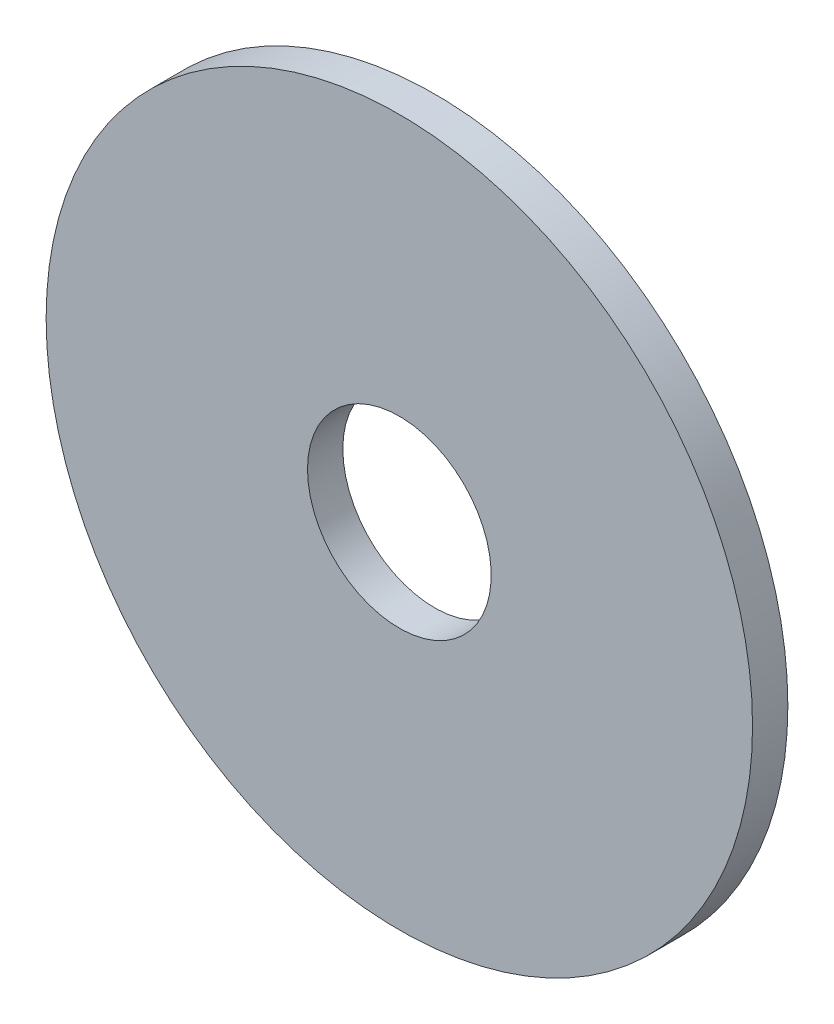
ISO-10303-21;
HEADER;
FILE_DESCRIPTION(('STEP AP214'),'2;1');
FILE_NAME('part.step','',(''),(''),'','','');
FILE_SCHEMA(('AUTOMOTIVE_DESIGN { 1 0 10303 214 1 1 1 1 }'));
ENDSEC;
DATA;
#1=APPLICATION_CONTEXT('core data for automotive mechanical design processes');
#2=APPLICATION_PROTOCOL_DEFINITION('international standard','automotive_design',2000,#1);
#3=PRODUCT_CONTEXT('',#1,'mechanical');
#4=PRODUCT('Part','Part','',(#3));
#5=PRODUCT_RELATED_PRODUCT_CATEGORY('part','',(#4));
#6=PRODUCT_DEFINITION_FORMATION('','',#4);
#7=PRODUCT_DEFINITION_CONTEXT('part definition',#1,'design');
#8=PRODUCT_DEFINITION('design','',#6,#7);
#9=PRODUCT_DEFINITION_SHAPE('','',#8);
#10=(LENGTH_UNIT() NAMED_UNIT(*) SI_UNIT(.MILLI.,.METRE.));
#11=(NAMED_UNIT(*) PLANE_ANGLE_UNIT() SI_UNIT($,.RADIAN.));
#12=(NAMED_UNIT(*) SI_UNIT($,.STERADIAN.) SOLID_ANGLE_UNIT());
#13=UNCERTAINTY_MEASURE_WITH_UNIT(LENGTH_MEASURE(1.E-05),#10,'distance_accuracy_value','');
#14=(GEOMETRIC_REPRESENTATION_CONTEXT(3) GLOBAL_UNCERTAINTY_ASSIGNED_CONTEXT((#13)) GLOBAL_UNIT_ASSIGNED_CONTEXT((#10,
#11,#12)) REPRESENTATION_CONTEXT('',''));
#15=CARTESIAN_POINT('',(0.,0.,0.));
#16=DIRECTION('',(0.,0.,1.));
#17=DIRECTION('',(1.,0.,0.));
#18=AXIS2_PLACEMENT_3D('',#15,#16,#17);
#19=CARTESIAN_POINT('',(2.6,0.,0.));
#20=DIRECTION('',(0.,0.,-1.));
#21=DIRECTION('',(-1.,0.,0.));
#22=AXIS2_PLACEMENT_3D('',#19,#20,#21);
#23=PLANE('',#22);
#24=CARTESIAN_POINT('',(0.,0.,0.));
#25=DIRECTION('',(0.,0.,-1.));
#26=DIRECTION('',(-1.,0.,0.));
#27=AXIS2_PLACEMENT_3D('',#24,#25,#26);
#28=CIRCLE('',#27,10.);
#29=CARTESIAN_POINT('',(-9.99999999999999,0.,0.));
#30=VERTEX_POINT('',#29);
#31=EDGE_CURVE('E10',#30,#30,#28,.T.);
#32=ORIENTED_EDGE('',*,*,#31,.T.);
#33=EDGE_LOOP('',(#32));
#34=FACE_BOUND('',#33,.T.);
#35=CARTESIAN_POINT('',(0.,0.,0.));
#36=DIRECTION('',(0.,0.,-1.));
#37=DIRECTION('',(-1.,0.,0.));
#38=AXIS2_PLACEMENT_3D('',#35,#36,#37);
#39=CIRCLE('',#38,2.6);
#40=CARTESIAN_POINT('',(-2.6,0.,0.));
#41=VERTEX_POINT('',#40);
#42=EDGE_CURVE('E42',#41,#41,#39,.T.);
#43=ORIENTED_EDGE('',*,*,#42,.F.);
#44=EDGE_LOOP('',(#43));
#45=FACE_BOUND('',#44,.T.);
#46=ADVANCED_FACE('F28',(#34,#45),#23,.T.);
#47=CARTESIAN_POINT('',(0.,0.,1.));
#48=DIRECTION('',(0.,0.,-1.));
#49=DIRECTION('',(-1.,0.,0.));
#50=AXIS2_PLACEMENT_3D('',#47,#48,#49);
#51=CYLINDRICAL_SURFACE('',#50,10.);
#52=CARTESIAN_POINT('',(0.,0.,1.));
#53=DIRECTION('',(0.,0.,-1.));
#54=DIRECTION('',(-1.,0.,0.));
#55=AXIS2_PLACEMENT_3D('',#52,#53,#54);
#56=CIRCLE('',#55,10.);
#57=CARTESIAN_POINT('',(-9.99999999999999,0.,1.));
#58=VERTEX_POINT('',#57);
#59=EDGE_CURVE('E34',#58,#58,#56,.T.);
#60=ORIENTED_EDGE('',*,*,#59,.T.);
#61=EDGE_LOOP('',(#60));
#62=FACE_BOUND('',#61,.T.);
#63=ORIENTED_EDGE('',*,*,#31,.F.);
#64=EDGE_LOOP('',(#63));
#65=FACE_BOUND('',#64,.T.);
#66=ADVANCED_FACE('F52',(#62,#65),#51,.T.);
#67=CARTESIAN_POINT('',(10.,0.,1.));
#68=DIRECTION('',(0.,0.,1.));
#69=DIRECTION('',(1.,0.,0.));
#70=AXIS2_PLACEMENT_3D('',#67,#68,#69);
#71=PLANE('',#70);
#72=CARTESIAN_POINT('',(0.,0.,1.));
#73=DIRECTION('',(0.,0.,-1.));
#74=DIRECTION('',(-1.,0.,0.));
#75=AXIS2_PLACEMENT_3D('',#72,#73,#74);
#76=CIRCLE('',#75,2.6);
#77=CARTESIAN_POINT('',(-2.6,0.,1.));
#78=VERTEX_POINT('',#77);
#79=EDGE_CURVE('E38',#78,#78,#76,.T.);
#80=ORIENTED_EDGE('',*,*,#79,.T.);
#81=EDGE_LOOP('',(#80));
#82=FACE_BOUND('',#81,.T.);
#83=ORIENTED_EDGE('',*,*,#59,.F.);
#84=EDGE_LOOP('',(#83));
#85=FACE_BOUND('',#84,.T.);
#86=ADVANCED_FACE('F56',(#82,#85),#71,.T.);
#87=CARTESIAN_POINT('',(0.,0.,1.));
#88=DIRECTION('',(0.,0.,-1.));
#89=DIRECTION('',(-1.,0.,0.));
#90=AXIS2_PLACEMENT_3D('',#87,#88,#89);
#91=CYLINDRICAL_SURFACE('',#90,2.6);
#92=ORIENTED_EDGE('',*,*,#42,.T.);
#93=EDGE_LOOP('',(#92));
#94=FACE_BOUND('',#93,.T.);
#95=ORIENTED_EDGE('',*,*,#79,.F.);
#96=EDGE_LOOP('',(#95));
#97=FACE_BOUND('',#96,.T.);
#98=ADVANCED_FACE('F48',(#94,#97),#91,.F.);
#99=CLOSED_SHELL('',(#46,#66,#86,#98));
#100=MANIFOLD_SOLID_BREP('B2',#99);
#101=ADVANCED_BREP_SHAPE_REPRESENTATION('',(#18,#100),#14);
#102=SHAPE_DEFINITION_REPRESENTATION(#9,#101);
ENDSEC;
END-ISO-10303-21;
